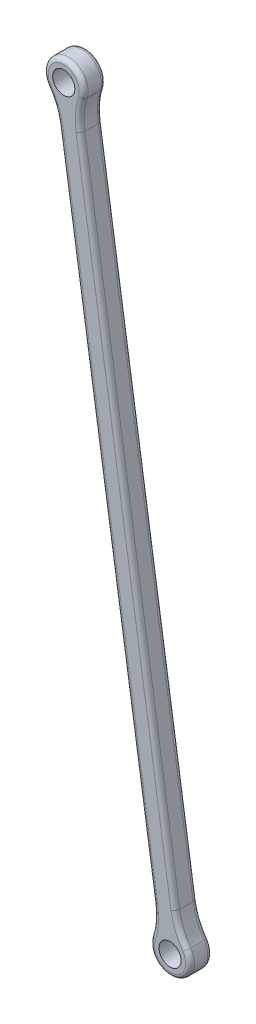
ISO-10303-21;
HEADER;
FILE_DESCRIPTION(('STEP AP214'),'2;1');
FILE_NAME('part.step','',(''),(''),'','','');
FILE_SCHEMA(('AUTOMOTIVE_DESIGN { 1 0 10303 214 1 1 1 1 }'));
ENDSEC;
DATA;
#1=APPLICATION_CONTEXT('core data for automotive mechanical design processes');
#2=APPLICATION_PROTOCOL_DEFINITION('international standard','automotive_design',2000,#1);
#3=PRODUCT_CONTEXT('',#1,'mechanical');
#4=PRODUCT('Part','Part','',(#3));
#5=PRODUCT_RELATED_PRODUCT_CATEGORY('part','',(#4));
#6=PRODUCT_DEFINITION_FORMATION('','',#4);
#7=PRODUCT_DEFINITION_CONTEXT('part definition',#1,'design');
#8=PRODUCT_DEFINITION('design','',#6,#7);
#9=PRODUCT_DEFINITION_SHAPE('','',#8);
#10=(LENGTH_UNIT() NAMED_UNIT(*) SI_UNIT(.MILLI.,.METRE.));
#11=(NAMED_UNIT(*) PLANE_ANGLE_UNIT() SI_UNIT($,.RADIAN.));
#12=(NAMED_UNIT(*) SI_UNIT($,.STERADIAN.) SOLID_ANGLE_UNIT());
#13=UNCERTAINTY_MEASURE_WITH_UNIT(LENGTH_MEASURE(1.E-05),#10,'distance_accuracy_value','');
#14=(GEOMETRIC_REPRESENTATION_CONTEXT(3) GLOBAL_UNCERTAINTY_ASSIGNED_CONTEXT((#13)) GLOBAL_UNIT_ASSIGNED_CONTEXT((#10,
#11,#12)) REPRESENTATION_CONTEXT('',''));
#15=CARTESIAN_POINT('',(0.,0.,0.));
#16=DIRECTION('',(0.,0.,1.));
#17=DIRECTION('',(1.,0.,0.));
#18=AXIS2_PLACEMENT_3D('',#15,#16,#17);
#19=CARTESIAN_POINT('',(44.6682604302253,6.76720332353716,2.5));
#20=DIRECTION('',(0.988717847963602,0.149789909934624,0.));
#21=DIRECTION('',(-0.149789909934624,0.988717847963602,0.));
#22=AXIS2_PLACEMENT_3D('',#19,#20,#21);
#23=PLANE('',#22);
#24=DIRECTION('',(0.,0.,-1.));
#25=VECTOR('',#24,1.);
#26=CARTESIAN_POINT('',(34.3540168829649,74.8484024368196,2.5));
#27=LINE('',#26,#25);
#28=CARTESIAN_POINT('',(34.3540168829649,74.8484024368196,1.5));
#29=VERTEX_POINT('',#28);
#30=CARTESIAN_POINT('',(34.3540168829649,74.8484024368196,-1.5));
#31=VERTEX_POINT('',#30);
#32=EDGE_CURVE('E298',#29,#31,#27,.T.);
#33=ORIENTED_EDGE('',*,*,#32,.T.);
#34=DIRECTION('',(0.149789909934624,-0.988717847963602,0.));
#35=VECTOR('',#34,1.);
#36=CARTESIAN_POINT('',(12.9647143473823,216.032713059969,-1.5));
#37=LINE('',#36,#35);
#38=CARTESIAN_POINT('',(12.9647143473823,216.032713059969,-1.5));
#39=VERTEX_POINT('',#38);
#40=EDGE_CURVE('E232',#31,#39,#37,.F.);
#41=ORIENTED_EDGE('',*,*,#40,.T.);
#42=DIRECTION('',(0.,0.,-1.));
#43=VECTOR('',#42,1.);
#44=CARTESIAN_POINT('',(12.9647143473823,216.032713059969,2.5));
#45=LINE('',#44,#43);
#46=CARTESIAN_POINT('',(12.9647143473823,216.032713059969,1.5));
#47=VERTEX_POINT('',#46);
#48=EDGE_CURVE('E294',#39,#47,#45,.F.);
#49=ORIENTED_EDGE('',*,*,#48,.T.);
#50=DIRECTION('',(0.149789909934624,-0.988717847963602,0.));
#51=VECTOR('',#50,1.);
#52=CARTESIAN_POINT('',(44.6682604302253,6.76720332353716,1.5));
#53=LINE('',#52,#51);
#54=EDGE_CURVE('E230',#47,#29,#53,.T.);
#55=ORIENTED_EDGE('',*,*,#54,.T.);
#56=EDGE_LOOP('',(#33,#41,#49,#55));
#57=FACE_BOUND('',#56,.T.);
#58=ADVANCED_FACE('F34',(#57),#23,.T.);
#59=CARTESIAN_POINT('',(9.20437820049462,224.163510810646,2.5));
#60=DIRECTION('',(0.,0.,-1.));
#61=DIRECTION('',(-1.,0.,0.));
#62=AXIS2_PLACEMENT_3D('',#59,#60,#61);
#63=CYLINDRICAL_SURFACE('',#62,4.50000000000002);
#64=DIRECTION('',(0.,0.,-1.));
#65=VECTOR('',#64,1.);
#66=CARTESIAN_POINT('',(13.4946329388812,222.805676402571,2.5));
#67=LINE('',#66,#65);
#68=CARTESIAN_POINT('',(13.4946329388812,222.805676402571,1.5));
#69=VERTEX_POINT('',#68);
#70=CARTESIAN_POINT('',(13.4946329388812,222.805676402571,-1.5));
#71=VERTEX_POINT('',#70);
#72=EDGE_CURVE('E173',#69,#71,#67,.T.);
#73=ORIENTED_EDGE('',*,*,#72,.T.);
#74=CARTESIAN_POINT('',(9.20437820049462,224.163510810646,-1.5));
#75=DIRECTION('',(0.,0.,1.));
#76=DIRECTION('',(1.,0.,0.));
#77=AXIS2_PLACEMENT_3D('',#74,#75,#76);
#78=CIRCLE('',#77,4.50000000000002);
#79=CARTESIAN_POINT('',(5.5088349360982,221.59583482233,-1.5));
#80=VERTEX_POINT('',#79);
#81=EDGE_CURVE('E228',#71,#80,#78,.T.);
#82=ORIENTED_EDGE('',*,*,#81,.T.);
#83=DIRECTION('',(0.,0.,-1.));
#84=VECTOR('',#83,1.);
#85=CARTESIAN_POINT('',(5.5088349360982,221.59583482233,2.5));
#86=LINE('',#85,#84);
#87=CARTESIAN_POINT('',(5.5088349360982,221.59583482233,1.5));
#88=VERTEX_POINT('',#87);
#89=EDGE_CURVE('E176',#80,#88,#86,.F.);
#90=ORIENTED_EDGE('',*,*,#89,.T.);
#91=CARTESIAN_POINT('',(9.20437820049462,224.163510810646,1.5));
#92=DIRECTION('',(0.,0.,1.));
#93=DIRECTION('',(1.,0.,0.));
#94=AXIS2_PLACEMENT_3D('',#91,#92,#93);
#95=CIRCLE('',#94,4.50000000000002);
#96=EDGE_CURVE('E226',#88,#69,#95,.F.);
#97=ORIENTED_EDGE('',*,*,#96,.T.);
#98=EDGE_LOOP('',(#73,#82,#90,#97));
#99=FACE_BOUND('',#98,.T.);
#100=ADVANCED_FACE('F308',(#99),#63,.T.);
#101=CARTESIAN_POINT('',(39.7246711904073,6.01825377386403,2.5));
#102=DIRECTION('',(0.988717847963602,0.149789909934624,0.));
#103=DIRECTION('',(-0.149789909934624,0.988717847963602,0.));
#104=AXIS2_PLACEMENT_3D('',#101,#102,#103);
#105=PLANE('',#104);
#106=DIRECTION('',(0.,0.,1.));
#107=VECTOR('',#106,1.);
#108=CARTESIAN_POINT('',(8.02112510756427,215.283763510296,-2.5));
#109=LINE('',#108,#107);
#110=CARTESIAN_POINT('',(8.02112510756427,215.283763510296,1.5));
#111=VERTEX_POINT('',#110);
#112=CARTESIAN_POINT('',(8.02112510756427,215.283763510296,-1.5));
#113=VERTEX_POINT('',#112);
#114=EDGE_CURVE('E295',#111,#113,#109,.F.);
#115=ORIENTED_EDGE('',*,*,#114,.T.);
#116=DIRECTION('',(0.149789909934624,-0.988717847963602,0.));
#117=VECTOR('',#116,1.);
#118=CARTESIAN_POINT('',(39.7246711904073,6.01825377386403,-1.5));
#119=LINE('',#118,#117);
#120=CARTESIAN_POINT('',(29.4104276431468,74.0994528871465,-1.5));
#121=VERTEX_POINT('',#120);
#122=EDGE_CURVE('E224',#113,#121,#119,.T.);
#123=ORIENTED_EDGE('',*,*,#122,.T.);
#124=DIRECTION('',(0.,0.,1.));
#125=VECTOR('',#124,1.);
#126=CARTESIAN_POINT('',(29.4104276431468,74.0994528871465,2.5));
#127=LINE('',#126,#125);
#128=CARTESIAN_POINT('',(29.4104276431468,74.0994528871465,1.5));
#129=VERTEX_POINT('',#128);
#130=EDGE_CURVE('E285',#121,#129,#127,.T.);
#131=ORIENTED_EDGE('',*,*,#130,.T.);
#132=DIRECTION('',(0.149789909934624,-0.988717847963602,0.));
#133=VECTOR('',#132,1.);
#134=CARTESIAN_POINT('',(8.02112510756426,215.283763510296,1.5));
#135=LINE('',#134,#133);
#136=EDGE_CURVE('E222',#129,#111,#135,.F.);
#137=ORIENTED_EDGE('',*,*,#136,.T.);
#138=EDGE_LOOP('',(#115,#123,#131,#137));
#139=FACE_BOUND('',#138,.T.);
#140=ADVANCED_FACE('F291',(#139),#105,.F.);
#141=CARTESIAN_POINT('',(33.1707637900345,65.9686551364697,2.5));
#142=DIRECTION('',(0.,0.,-1.));
#143=DIRECTION('',(-1.,0.,0.));
#144=AXIS2_PLACEMENT_3D('',#141,#142,#143);
#145=CYLINDRICAL_SURFACE('',#144,4.50000000000002);
#146=DIRECTION('',(0.,0.,-1.));
#147=VECTOR('',#146,1.);
#148=CARTESIAN_POINT('',(28.8805090516479,67.3264895445445,2.5));
#149=LINE('',#148,#147);
#150=CARTESIAN_POINT('',(28.8805090516479,67.3264895445445,1.5));
#151=VERTEX_POINT('',#150);
#152=CARTESIAN_POINT('',(28.8805090516479,67.3264895445445,-1.5));
#153=VERTEX_POINT('',#152);
#154=EDGE_CURVE('E288',#151,#153,#149,.T.);
#155=ORIENTED_EDGE('',*,*,#154,.T.);
#156=CARTESIAN_POINT('',(33.1707637900345,65.9686551364697,-1.5));
#157=DIRECTION('',(0.,0.,1.));
#158=DIRECTION('',(1.,0.,0.));
#159=AXIS2_PLACEMENT_3D('',#156,#157,#158);
#160=CIRCLE('',#159,4.50000000000002);
#161=CARTESIAN_POINT('',(36.8663070544309,68.5363311247857,-1.5));
#162=VERTEX_POINT('',#161);
#163=EDGE_CURVE('E11',#153,#162,#160,.T.);
#164=ORIENTED_EDGE('',*,*,#163,.T.);
#165=DIRECTION('',(0.,0.,-1.));
#166=VECTOR('',#165,1.);
#167=CARTESIAN_POINT('',(36.8663070544309,68.5363311247857,2.5));
#168=LINE('',#167,#166);
#169=CARTESIAN_POINT('',(36.8663070544309,68.5363311247857,1.5));
#170=VERTEX_POINT('',#169);
#171=EDGE_CURVE('E613',#162,#170,#168,.F.);
#172=ORIENTED_EDGE('',*,*,#171,.T.);
#173=CARTESIAN_POINT('',(33.1707637900345,65.9686551364697,1.5));
#174=DIRECTION('',(0.,0.,1.));
#175=DIRECTION('',(1.,0.,0.));
#176=AXIS2_PLACEMENT_3D('',#173,#174,#175);
#177=CIRCLE('',#176,4.50000000000002);
#178=EDGE_CURVE('E43',#170,#151,#177,.F.);
#179=ORIENTED_EDGE('',*,*,#178,.T.);
#180=EDGE_LOOP('',(#155,#164,#172,#179));
#181=FACE_BOUND('',#180,.T.);
#182=ADVANCED_FACE('F373',(#181),#145,.T.);
#183=CARTESIAN_POINT('',(33.1707637900345,65.9686551364697,2.5));
#184=DIRECTION('',(0.,0.,-1.));
#185=DIRECTION('',(-1.,0.,0.));
#186=AXIS2_PLACEMENT_3D('',#183,#184,#185);
#187=CYLINDRICAL_SURFACE('',#186,2.5);
#188=CARTESIAN_POINT('',(33.1707637900345,65.9686551364697,2.5));
#189=DIRECTION('',(0.,0.,1.));
#190=DIRECTION('',(1.,0.,0.));
#191=AXIS2_PLACEMENT_3D('',#188,#189,#190);
#192=CIRCLE('',#191,2.5);
#193=CARTESIAN_POINT('',(35.6707637900345,65.9686551364697,2.5));
#194=VERTEX_POINT('',#193);
#195=EDGE_CURVE('E605',#194,#194,#192,.T.);
#196=ORIENTED_EDGE('',*,*,#195,.T.);
#197=EDGE_LOOP('',(#196));
#198=FACE_BOUND('',#197,.T.);
#199=CARTESIAN_POINT('',(33.1707637900345,65.9686551364697,-2.5));
#200=DIRECTION('',(0.,0.,1.));
#201=DIRECTION('',(1.,0.,0.));
#202=AXIS2_PLACEMENT_3D('',#199,#200,#201);
#203=CIRCLE('',#202,2.5);
#204=CARTESIAN_POINT('',(35.6707637900345,65.9686551364697,-2.5));
#205=VERTEX_POINT('',#204);
#206=EDGE_CURVE('E250',#205,#205,#203,.T.);
#207=ORIENTED_EDGE('',*,*,#206,.F.);
#208=EDGE_LOOP('',(#207));
#209=FACE_BOUND('',#208,.T.);
#210=ADVANCED_FACE('F369',(#198,#209),#187,.F.);
#211=CARTESIAN_POINT('',(9.20437820049462,224.163510810646,2.5));
#212=DIRECTION('',(0.,0.,-1.));
#213=DIRECTION('',(-1.,0.,0.));
#214=AXIS2_PLACEMENT_3D('',#211,#212,#213);
#215=CYLINDRICAL_SURFACE('',#214,2.5);
#216=CARTESIAN_POINT('',(9.20437820049462,224.163510810646,2.5));
#217=DIRECTION('',(0.,0.,1.));
#218=DIRECTION('',(1.,0.,0.));
#219=AXIS2_PLACEMENT_3D('',#216,#217,#218);
#220=CIRCLE('',#219,2.5);
#221=CARTESIAN_POINT('',(11.7043782004946,224.163510810646,2.5));
#222=VERTEX_POINT('',#221);
#223=EDGE_CURVE('E600',#222,#222,#220,.T.);
#224=ORIENTED_EDGE('',*,*,#223,.T.);
#225=EDGE_LOOP('',(#224));
#226=FACE_BOUND('',#225,.T.);
#227=CARTESIAN_POINT('',(9.20437820049462,224.163510810646,-2.5));
#228=DIRECTION('',(0.,0.,1.));
#229=DIRECTION('',(1.,0.,0.));
#230=AXIS2_PLACEMENT_3D('',#227,#228,#229);
#231=CIRCLE('',#230,2.5);
#232=CARTESIAN_POINT('',(11.7043782004946,224.163510810646,-2.5));
#233=VERTEX_POINT('',#232);
#234=EDGE_CURVE('E603',#233,#233,#231,.T.);
#235=ORIENTED_EDGE('',*,*,#234,.F.);
#236=EDGE_LOOP('',(#235));
#237=FACE_BOUND('',#236,.T.);
#238=ADVANCED_FACE('F372',(#226,#237),#215,.F.);
#239=CARTESIAN_POINT('',(0.,0.,2.5));
#240=DIRECTION('',(0.,0.,1.));
#241=DIRECTION('',(1.,0.,0.));
#242=AXIS2_PLACEMENT_3D('',#239,#240,#241);
#243=PLANE('',#242);
#244=CARTESIAN_POINT('',(-6.80964261188977,213.036914861277,2.5));
#245=DIRECTION('',(0.,0.,1.));
#246=DIRECTION('',(1.,0.,0.));
#247=AXIS2_PLACEMENT_3D('',#244,#245,#246);
#248=CIRCLE('',#247,16.);
#249=CARTESIAN_POINT('',(6.33006677263073,222.1664294864,2.5));
#250=VERTEX_POINT('',#249);
#251=CARTESIAN_POINT('',(9.00984295552787,215.433553420231,2.5));
#252=VERTEX_POINT('',#251);
#253=EDGE_CURVE('E51',#250,#252,#248,.F.);
#254=ORIENTED_EDGE('',*,*,#253,.T.);
#255=DIRECTION('',(0.149789909934624,-0.988717847963602,0.));
#256=VECTOR('',#255,1.);
#257=CARTESIAN_POINT('',(30.3991454911104,74.2492427970811,2.5));
#258=LINE('',#257,#256);
#259=CARTESIAN_POINT('',(30.3991454911104,74.2492427970811,2.5));
#260=VERTEX_POINT('',#259);
#261=EDGE_CURVE('E55',#252,#260,#258,.T.);
#262=ORIENTED_EDGE('',*,*,#261,.T.);
#263=CARTESIAN_POINT('',(14.5796599236928,71.8526042381271,2.5));
#264=DIRECTION('',(0.,0.,1.));
#265=DIRECTION('',(1.,0.,0.));
#266=AXIS2_PLACEMENT_3D('',#263,#264,#265);
#267=CIRCLE('',#266,16.);
#268=CARTESIAN_POINT('',(29.8338989935116,67.0247485649723,2.5));
#269=VERTEX_POINT('',#268);
#270=EDGE_CURVE('E218',#260,#269,#267,.F.);
#271=ORIENTED_EDGE('',*,*,#270,.T.);
#272=CARTESIAN_POINT('',(33.1707637900345,65.9686551364697,2.5));
#273=DIRECTION('',(0.,0.,1.));
#274=DIRECTION('',(1.,0.,0.));
#275=AXIS2_PLACEMENT_3D('',#272,#273,#274);
#276=CIRCLE('',#275,3.50000000000002);
#277=CARTESIAN_POINT('',(36.0450752178984,67.9657364607155,2.5));
#278=VERTEX_POINT('',#277);
#279=EDGE_CURVE('E216',#269,#278,#276,.T.);
#280=ORIENTED_EDGE('',*,*,#279,.T.);
#281=CARTESIAN_POINT('',(49.1847846024189,77.095251085839,2.5));
#282=DIRECTION('',(0.,0.,1.));
#283=DIRECTION('',(1.,0.,0.));
#284=AXIS2_PLACEMENT_3D('',#281,#282,#283);
#285=CIRCLE('',#284,16.);
#286=CARTESIAN_POINT('',(33.3652990350013,74.698612526885,2.5));
#287=VERTEX_POINT('',#286);
#288=EDGE_CURVE('E209',#278,#287,#285,.F.);
#289=ORIENTED_EDGE('',*,*,#288,.T.);
#290=DIRECTION('',(0.149789909934624,-0.988717847963602,0.));
#291=VECTOR('',#290,1.);
#292=CARTESIAN_POINT('',(43.6795425822617,6.61741341360253,2.5));
#293=LINE('',#292,#291);
#294=CARTESIAN_POINT('',(11.9759964994187,215.882923150035,2.5));
#295=VERTEX_POINT('',#294);
#296=EDGE_CURVE('E207',#287,#295,#293,.F.);
#297=ORIENTED_EDGE('',*,*,#296,.T.);
#298=CARTESIAN_POINT('',(27.7954820668363,218.279561708989,2.5));
#299=DIRECTION('',(0.,0.,1.));
#300=DIRECTION('',(1.,0.,0.));
#301=AXIS2_PLACEMENT_3D('',#298,#299,#300);
#302=CIRCLE('',#301,16.);
#303=CARTESIAN_POINT('',(12.5412429970175,223.107417382143,2.5));
#304=VERTEX_POINT('',#303);
#305=EDGE_CURVE('E211',#295,#304,#302,.F.);
#306=ORIENTED_EDGE('',*,*,#305,.T.);
#307=CARTESIAN_POINT('',(9.20437820049462,224.163510810646,2.5));
#308=DIRECTION('',(0.,0.,1.));
#309=DIRECTION('',(1.,0.,0.));
#310=AXIS2_PLACEMENT_3D('',#307,#308,#309);
#311=CIRCLE('',#310,3.50000000000002);
#312=EDGE_CURVE('E214',#304,#250,#311,.T.);
#313=ORIENTED_EDGE('',*,*,#312,.T.);
#314=EDGE_LOOP('',(#254,#262,#271,#280,#289,#297,#306,#313));
#315=FACE_BOUND('',#314,.T.);
#316=ORIENTED_EDGE('',*,*,#195,.F.);
#317=EDGE_LOOP('',(#316));
#318=FACE_BOUND('',#317,.T.);
#319=ORIENTED_EDGE('',*,*,#223,.F.);
#320=EDGE_LOOP('',(#319));
#321=FACE_BOUND('',#320,.T.);
#322=ADVANCED_FACE('F525',(#315,#318,#321),#243,.T.);
#323=CARTESIAN_POINT('',(0.,0.,-2.5));
#324=DIRECTION('',(0.,0.,1.));
#325=DIRECTION('',(1.,0.,0.));
#326=AXIS2_PLACEMENT_3D('',#323,#324,#325);
#327=PLANE('',#326);
#328=CARTESIAN_POINT('',(-6.80964261188977,213.036914861277,-2.5));
#329=DIRECTION('',(0.,0.,1.));
#330=DIRECTION('',(1.,0.,0.));
#331=AXIS2_PLACEMENT_3D('',#328,#329,#330);
#332=CIRCLE('',#331,16.);
#333=CARTESIAN_POINT('',(9.00984295552787,215.433553420231,-2.5));
#334=VERTEX_POINT('',#333);
#335=CARTESIAN_POINT('',(6.33006677263074,222.1664294864,-2.5));
#336=VERTEX_POINT('',#335);
#337=EDGE_CURVE('E186',#334,#336,#332,.T.);
#338=ORIENTED_EDGE('',*,*,#337,.T.);
#339=CARTESIAN_POINT('',(9.20437820049462,224.163510810646,-2.5));
#340=DIRECTION('',(0.,0.,1.));
#341=DIRECTION('',(1.,0.,0.));
#342=AXIS2_PLACEMENT_3D('',#339,#340,#341);
#343=CIRCLE('',#342,3.50000000000002);
#344=CARTESIAN_POINT('',(12.5412429970175,223.107417382143,-2.5));
#345=VERTEX_POINT('',#344);
#346=EDGE_CURVE('E188',#336,#345,#343,.F.);
#347=ORIENTED_EDGE('',*,*,#346,.T.);
#348=CARTESIAN_POINT('',(27.7954820668363,218.279561708989,-2.5));
#349=DIRECTION('',(0.,0.,1.));
#350=DIRECTION('',(1.,0.,0.));
#351=AXIS2_PLACEMENT_3D('',#348,#349,#350);
#352=CIRCLE('',#351,16.);
#353=CARTESIAN_POINT('',(11.9759964994187,215.882923150035,-2.5));
#354=VERTEX_POINT('',#353);
#355=EDGE_CURVE('E184',#345,#354,#352,.T.);
#356=ORIENTED_EDGE('',*,*,#355,.T.);
#357=DIRECTION('',(0.149789909934624,-0.988717847963602,0.));
#358=VECTOR('',#357,1.);
#359=CARTESIAN_POINT('',(33.3652990350013,74.698612526885,-2.5));
#360=LINE('',#359,#358);
#361=CARTESIAN_POINT('',(33.3652990350013,74.698612526885,-2.5));
#362=VERTEX_POINT('',#361);
#363=EDGE_CURVE('E154',#354,#362,#360,.T.);
#364=ORIENTED_EDGE('',*,*,#363,.T.);
#365=CARTESIAN_POINT('',(49.1847846024189,77.095251085839,-2.5));
#366=DIRECTION('',(0.,0.,1.));
#367=DIRECTION('',(1.,0.,0.));
#368=AXIS2_PLACEMENT_3D('',#365,#366,#367);
#369=CIRCLE('',#368,16.);
#370=CARTESIAN_POINT('',(36.0450752178984,67.9657364607155,-2.5));
#371=VERTEX_POINT('',#370);
#372=EDGE_CURVE('E145',#362,#371,#369,.T.);
#373=ORIENTED_EDGE('',*,*,#372,.T.);
#374=CARTESIAN_POINT('',(33.1707637900345,65.9686551364697,-2.5));
#375=DIRECTION('',(0.,0.,1.));
#376=DIRECTION('',(1.,0.,0.));
#377=AXIS2_PLACEMENT_3D('',#374,#375,#376);
#378=CIRCLE('',#377,3.50000000000002);
#379=CARTESIAN_POINT('',(29.8338989935116,67.0247485649723,-2.5));
#380=VERTEX_POINT('',#379);
#381=EDGE_CURVE('E151',#371,#380,#378,.F.);
#382=ORIENTED_EDGE('',*,*,#381,.T.);
#383=CARTESIAN_POINT('',(14.5796599236928,71.8526042381271,-2.5));
#384=DIRECTION('',(0.,0.,1.));
#385=DIRECTION('',(1.,0.,0.));
#386=AXIS2_PLACEMENT_3D('',#383,#384,#385);
#387=CIRCLE('',#386,16.);
#388=CARTESIAN_POINT('',(30.3991454911104,74.2492427970811,-2.5));
#389=VERTEX_POINT('',#388);
#390=EDGE_CURVE('E158',#380,#389,#387,.T.);
#391=ORIENTED_EDGE('',*,*,#390,.T.);
#392=DIRECTION('',(0.149789909934624,-0.988717847963602,0.));
#393=VECTOR('',#392,1.);
#394=CARTESIAN_POINT('',(40.7133890383709,6.16804368379866,-2.5));
#395=LINE('',#394,#393);
#396=EDGE_CURVE('E182',#389,#334,#395,.F.);
#397=ORIENTED_EDGE('',*,*,#396,.T.);
#398=EDGE_LOOP('',(#338,#347,#356,#364,#373,#382,#391,#397));
#399=FACE_BOUND('',#398,.T.);
#400=ORIENTED_EDGE('',*,*,#206,.T.);
#401=EDGE_LOOP('',(#400));
#402=FACE_BOUND('',#401,.T.);
#403=ORIENTED_EDGE('',*,*,#234,.T.);
#404=EDGE_LOOP('',(#403));
#405=FACE_BOUND('',#404,.T.);
#406=ADVANCED_FACE('F147',(#399,#402,#405),#327,.F.);
#407=CARTESIAN_POINT('',(14.5796599236928,71.8526042381271,2.5));
#408=DIRECTION('',(0.,0.,-1.));
#409=DIRECTION('',(-1.,0.,0.));
#410=AXIS2_PLACEMENT_3D('',#407,#408,#409);
#411=CYLINDRICAL_SURFACE('',#410,15.);
#412=ORIENTED_EDGE('',*,*,#130,.F.);
#413=CARTESIAN_POINT('',(14.5796599236928,71.8526042381271,-1.5));
#414=DIRECTION('',(0.,0.,1.));
#415=DIRECTION('',(1.,0.,0.));
#416=AXIS2_PLACEMENT_3D('',#413,#414,#415);
#417=CIRCLE('',#416,15.);
#418=EDGE_CURVE('E192',#121,#153,#417,.F.);
#419=ORIENTED_EDGE('',*,*,#418,.T.);
#420=ORIENTED_EDGE('',*,*,#154,.F.);
#421=CARTESIAN_POINT('',(14.5796599236928,71.8526042381271,1.5));
#422=DIRECTION('',(0.,0.,1.));
#423=DIRECTION('',(1.,0.,0.));
#424=AXIS2_PLACEMENT_3D('',#421,#422,#423);
#425=CIRCLE('',#424,15.);
#426=EDGE_CURVE('E190',#151,#129,#425,.T.);
#427=ORIENTED_EDGE('',*,*,#426,.T.);
#428=EDGE_LOOP('',(#412,#419,#420,#427));
#429=FACE_BOUND('',#428,.T.);
#430=ADVANCED_FACE('F284',(#429),#411,.F.);
#431=CARTESIAN_POINT('',(49.1847846024189,77.095251085839,2.5));
#432=DIRECTION('',(0.,0.,-1.));
#433=DIRECTION('',(-1.,0.,0.));
#434=AXIS2_PLACEMENT_3D('',#431,#432,#433);
#435=CYLINDRICAL_SURFACE('',#434,15.);
#436=ORIENTED_EDGE('',*,*,#171,.F.);
#437=CARTESIAN_POINT('',(49.1847846024189,77.095251085839,-1.5));
#438=DIRECTION('',(0.,0.,1.));
#439=DIRECTION('',(1.,0.,0.));
#440=AXIS2_PLACEMENT_3D('',#437,#438,#439);
#441=CIRCLE('',#440,15.);
#442=EDGE_CURVE('E164',#162,#31,#441,.F.);
#443=ORIENTED_EDGE('',*,*,#442,.T.);
#444=ORIENTED_EDGE('',*,*,#32,.F.);
#445=CARTESIAN_POINT('',(49.1847846024189,77.095251085839,1.5));
#446=DIRECTION('',(0.,0.,1.));
#447=DIRECTION('',(1.,0.,0.));
#448=AXIS2_PLACEMENT_3D('',#445,#446,#447);
#449=CIRCLE('',#448,15.);
#450=EDGE_CURVE('E204',#29,#170,#449,.T.);
#451=ORIENTED_EDGE('',*,*,#450,.T.);
#452=EDGE_LOOP('',(#436,#443,#444,#451));
#453=FACE_BOUND('',#452,.T.);
#454=ADVANCED_FACE('F377',(#453),#435,.F.);
#455=CARTESIAN_POINT('',(27.7954820668363,218.279561708989,2.5));
#456=DIRECTION('',(0.,0.,-1.));
#457=DIRECTION('',(-1.,0.,0.));
#458=AXIS2_PLACEMENT_3D('',#455,#456,#457);
#459=CYLINDRICAL_SURFACE('',#458,15.);
#460=ORIENTED_EDGE('',*,*,#48,.F.);
#461=CARTESIAN_POINT('',(27.7954820668363,218.279561708989,-1.5));
#462=DIRECTION('',(0.,0.,1.));
#463=DIRECTION('',(1.,0.,0.));
#464=AXIS2_PLACEMENT_3D('',#461,#462,#463);
#465=CIRCLE('',#464,15.);
#466=EDGE_CURVE('E202',#39,#71,#465,.F.);
#467=ORIENTED_EDGE('',*,*,#466,.T.);
#468=ORIENTED_EDGE('',*,*,#72,.F.);
#469=CARTESIAN_POINT('',(27.7954820668363,218.279561708989,1.5));
#470=DIRECTION('',(0.,0.,1.));
#471=DIRECTION('',(1.,0.,0.));
#472=AXIS2_PLACEMENT_3D('',#469,#470,#471);
#473=CIRCLE('',#472,15.);
#474=EDGE_CURVE('E199',#69,#47,#473,.T.);
#475=ORIENTED_EDGE('',*,*,#474,.T.);
#476=EDGE_LOOP('',(#460,#467,#468,#475));
#477=FACE_BOUND('',#476,.T.);
#478=ADVANCED_FACE('F329',(#477),#459,.F.);
#479=CARTESIAN_POINT('',(-6.80964261188977,213.036914861277,2.5));
#480=DIRECTION('',(0.,0.,-1.));
#481=DIRECTION('',(-1.,0.,0.));
#482=AXIS2_PLACEMENT_3D('',#479,#480,#481);
#483=CYLINDRICAL_SURFACE('',#482,15.);
#484=ORIENTED_EDGE('',*,*,#89,.F.);
#485=CARTESIAN_POINT('',(-6.80964261188977,213.036914861277,-1.5));
#486=DIRECTION('',(0.,0.,1.));
#487=DIRECTION('',(1.,0.,0.));
#488=AXIS2_PLACEMENT_3D('',#485,#486,#487);
#489=CIRCLE('',#488,15.);
#490=EDGE_CURVE('E197',#80,#113,#489,.F.);
#491=ORIENTED_EDGE('',*,*,#490,.T.);
#492=ORIENTED_EDGE('',*,*,#114,.F.);
#493=CARTESIAN_POINT('',(-6.80964261188977,213.036914861277,1.5));
#494=DIRECTION('',(0.,0.,1.));
#495=DIRECTION('',(1.,0.,0.));
#496=AXIS2_PLACEMENT_3D('',#493,#494,#495);
#497=CIRCLE('',#496,15.);
#498=EDGE_CURVE('E195',#111,#88,#497,.T.);
#499=ORIENTED_EDGE('',*,*,#498,.T.);
#500=EDGE_LOOP('',(#484,#491,#492,#499));
#501=FACE_BOUND('',#500,.T.);
#502=ADVANCED_FACE('F349',(#501),#483,.F.);
#503=CARTESIAN_POINT('',(27.7954820668363,218.279561708989,-1.5));
#504=DIRECTION('',(0.,0.,1.));
#505=DIRECTION('',(1.,0.,0.));
#506=AXIS2_PLACEMENT_3D('',#503,#504,#505);
#507=TOROIDAL_SURFACE('',#506,16.,1.);
#508=CARTESIAN_POINT('',(12.5412429970175,223.107417382143,-1.5));
#509=DIRECTION('',(0.301740979572169,0.953389941863678,0.));
#510=DIRECTION('',(-0.953389941863678,0.301740979572169,0.));
#511=AXIS2_PLACEMENT_3D('',#508,#509,#510);
#512=CIRCLE('',#511,1.);
#513=EDGE_CURVE('E244',#71,#345,#512,.T.);
#514=ORIENTED_EDGE('',*,*,#513,.F.);
#515=ORIENTED_EDGE('',*,*,#466,.F.);
#516=CARTESIAN_POINT('',(11.9759964994187,215.882923150035,-1.5));
#517=DIRECTION('',(0.149789909934639,-0.9887178479636,0.));
#518=DIRECTION('',(0.9887178479636,0.149789909934639,0.));
#519=AXIS2_PLACEMENT_3D('',#516,#517,#518);
#520=CIRCLE('',#519,1.);
#521=EDGE_CURVE('E247',#354,#39,#520,.T.);
#522=ORIENTED_EDGE('',*,*,#521,.F.);
#523=ORIENTED_EDGE('',*,*,#355,.F.);
#524=EDGE_LOOP('',(#514,#515,#522,#523));
#525=FACE_BOUND('',#524,.T.);
#526=ADVANCED_FACE('F340',(#525),#507,.T.);
#527=CARTESIAN_POINT('',(43.6795425822617,6.61741341360253,-1.5));
#528=DIRECTION('',(-0.149789909934624,0.988717847963602,0.));
#529=DIRECTION('',(-0.988717847963602,-0.149789909934624,0.));
#530=AXIS2_PLACEMENT_3D('',#527,#528,#529);
#531=CYLINDRICAL_SURFACE('',#530,1.);
#532=ORIENTED_EDGE('',*,*,#521,.T.);
#533=ORIENTED_EDGE('',*,*,#40,.F.);
#534=CARTESIAN_POINT('',(33.3652990350013,74.698612526885,-1.5));
#535=DIRECTION('',(0.149789909934625,-0.988717847963602,0.));
#536=DIRECTION('',(0.988717847963602,0.149789909934625,0.));
#537=AXIS2_PLACEMENT_3D('',#534,#535,#536);
#538=CIRCLE('',#537,1.);
#539=EDGE_CURVE('E242',#362,#31,#538,.T.);
#540=ORIENTED_EDGE('',*,*,#539,.F.);
#541=ORIENTED_EDGE('',*,*,#363,.F.);
#542=EDGE_LOOP('',(#532,#533,#540,#541));
#543=FACE_BOUND('',#542,.T.);
#544=ADVANCED_FACE('F335',(#543),#531,.T.);
#545=CARTESIAN_POINT('',(9.20437820049462,224.163510810646,-1.5));
#546=DIRECTION('',(0.,0.,1.));
#547=DIRECTION('',(1.,0.,0.));
#548=AXIS2_PLACEMENT_3D('',#545,#546,#547);
#549=TOROIDAL_SURFACE('',#548,3.50000000000002,1.);
#550=ORIENTED_EDGE('',*,*,#513,.T.);
#551=ORIENTED_EDGE('',*,*,#346,.F.);
#552=CARTESIAN_POINT('',(6.33006677263074,222.1664294864,-1.5));
#553=DIRECTION('',(0.57059466407022,-0.82123183653253,0.));
#554=DIRECTION('',(0.82123183653253,0.570594664070221,0.));
#555=AXIS2_PLACEMENT_3D('',#552,#553,#554);
#556=CIRCLE('',#555,1.);
#557=EDGE_CURVE('E167',#80,#336,#556,.T.);
#558=ORIENTED_EDGE('',*,*,#557,.F.);
#559=ORIENTED_EDGE('',*,*,#81,.F.);
#560=EDGE_LOOP('',(#550,#551,#558,#559));
#561=FACE_BOUND('',#560,.T.);
#562=ADVANCED_FACE('F343',(#561),#549,.T.);
#563=CARTESIAN_POINT('',(49.1847846024189,77.095251085839,-1.5));
#564=DIRECTION('',(0.,0.,1.));
#565=DIRECTION('',(1.,0.,0.));
#566=AXIS2_PLACEMENT_3D('',#563,#564,#565);
#567=TOROIDAL_SURFACE('',#566,16.,1.);
#568=ORIENTED_EDGE('',*,*,#539,.T.);
#569=ORIENTED_EDGE('',*,*,#442,.F.);
#570=CARTESIAN_POINT('',(36.0450752178984,67.9657364607155,-1.5));
#571=DIRECTION('',(0.570594664070223,-0.821231836532529,0.));
#572=DIRECTION('',(0.821231836532529,0.570594664070223,0.));
#573=AXIS2_PLACEMENT_3D('',#570,#571,#572);
#574=CIRCLE('',#573,1.);
#575=EDGE_CURVE('E162',#371,#162,#574,.T.);
#576=ORIENTED_EDGE('',*,*,#575,.F.);
#577=ORIENTED_EDGE('',*,*,#372,.F.);
#578=EDGE_LOOP('',(#568,#569,#576,#577));
#579=FACE_BOUND('',#578,.T.);
#580=ADVANCED_FACE('F163',(#579),#567,.T.);
#581=CARTESIAN_POINT('',(-6.80964261188977,213.036914861277,-1.5));
#582=DIRECTION('',(0.,0.,1.));
#583=DIRECTION('',(1.,0.,0.));
#584=AXIS2_PLACEMENT_3D('',#581,#582,#583);
#585=TOROIDAL_SURFACE('',#584,16.,1.);
#586=ORIENTED_EDGE('',*,*,#557,.T.);
#587=ORIENTED_EDGE('',*,*,#337,.F.);
#588=CARTESIAN_POINT('',(9.00984295552787,215.433553420231,-1.5));
#589=DIRECTION('',(0.149789909934611,-0.988717847963604,0.));
#590=DIRECTION('',(0.988717847963604,0.149789909934611,0.));
#591=AXIS2_PLACEMENT_3D('',#588,#589,#590);
#592=CIRCLE('',#591,1.);
#593=EDGE_CURVE('E168',#113,#334,#592,.T.);
#594=ORIENTED_EDGE('',*,*,#593,.F.);
#595=ORIENTED_EDGE('',*,*,#490,.F.);
#596=EDGE_LOOP('',(#586,#587,#594,#595));
#597=FACE_BOUND('',#596,.T.);
#598=ADVANCED_FACE('F348',(#597),#585,.T.);
#599=CARTESIAN_POINT('',(33.1707637900345,65.9686551364697,-1.5));
#600=DIRECTION('',(0.,0.,1.));
#601=DIRECTION('',(1.,0.,0.));
#602=AXIS2_PLACEMENT_3D('',#599,#600,#601);
#603=TOROIDAL_SURFACE('',#602,3.50000000000002,1.);
#604=ORIENTED_EDGE('',*,*,#575,.T.);
#605=ORIENTED_EDGE('',*,*,#163,.F.);
#606=CARTESIAN_POINT('',(29.8338989935116,67.0247485649723,-1.5));
#607=DIRECTION('',(0.301740979572168,0.953389941863679,0.));
#608=DIRECTION('',(-0.953389941863679,0.301740979572168,0.));
#609=AXIS2_PLACEMENT_3D('',#606,#607,#608);
#610=CIRCLE('',#609,1.);
#611=EDGE_CURVE('E171',#380,#153,#610,.T.);
#612=ORIENTED_EDGE('',*,*,#611,.F.);
#613=ORIENTED_EDGE('',*,*,#381,.F.);
#614=EDGE_LOOP('',(#604,#605,#612,#613));
#615=FACE_BOUND('',#614,.T.);
#616=ADVANCED_FACE('F170',(#615),#603,.T.);
#617=CARTESIAN_POINT('',(40.7133890383709,6.16804368379866,-1.5));
#618=DIRECTION('',(0.149789909934624,-0.988717847963602,0.));
#619=DIRECTION('',(0.988717847963602,0.149789909934624,0.));
#620=AXIS2_PLACEMENT_3D('',#617,#618,#619);
#621=CYLINDRICAL_SURFACE('',#620,1.);
#622=ORIENTED_EDGE('',*,*,#593,.T.);
#623=ORIENTED_EDGE('',*,*,#396,.F.);
#624=CARTESIAN_POINT('',(30.3991454911104,74.2492427970811,-1.5));
#625=DIRECTION('',(0.149789909934625,-0.988717847963602,0.));
#626=DIRECTION('',(0.988717847963602,0.149789909934625,0.));
#627=AXIS2_PLACEMENT_3D('',#624,#625,#626);
#628=CIRCLE('',#627,1.);
#629=EDGE_CURVE('E235',#121,#389,#628,.T.);
#630=ORIENTED_EDGE('',*,*,#629,.F.);
#631=ORIENTED_EDGE('',*,*,#122,.F.);
#632=EDGE_LOOP('',(#622,#623,#630,#631));
#633=FACE_BOUND('',#632,.T.);
#634=ADVANCED_FACE('F388',(#633),#621,.T.);
#635=CARTESIAN_POINT('',(14.5796599236928,71.8526042381271,-1.5));
#636=DIRECTION('',(0.,0.,1.));
#637=DIRECTION('',(1.,0.,0.));
#638=AXIS2_PLACEMENT_3D('',#635,#636,#637);
#639=TOROIDAL_SURFACE('',#638,16.,1.);
#640=ORIENTED_EDGE('',*,*,#611,.T.);
#641=ORIENTED_EDGE('',*,*,#418,.F.);
#642=ORIENTED_EDGE('',*,*,#629,.T.);
#643=ORIENTED_EDGE('',*,*,#390,.F.);
#644=EDGE_LOOP('',(#640,#641,#642,#643));
#645=FACE_BOUND('',#644,.T.);
#646=ADVANCED_FACE('F385',(#645),#639,.T.);
#647=CARTESIAN_POINT('',(14.5796599236928,71.8526042381271,1.5));
#648=DIRECTION('',(0.,0.,1.));
#649=DIRECTION('',(1.,0.,0.));
#650=AXIS2_PLACEMENT_3D('',#647,#648,#649);
#651=TOROIDAL_SURFACE('',#650,16.,1.);
#652=CARTESIAN_POINT('',(30.3991454911104,74.2492427970811,1.5));
#653=DIRECTION('',(-0.149789909934625,0.988717847963602,0.));
#654=DIRECTION('',(-0.988717847963602,-0.149789909934625,0.));
#655=AXIS2_PLACEMENT_3D('',#652,#653,#654);
#656=CIRCLE('',#655,1.);
#657=EDGE_CURVE('E266',#129,#260,#656,.T.);
#658=ORIENTED_EDGE('',*,*,#657,.F.);
#659=ORIENTED_EDGE('',*,*,#426,.F.);
#660=CARTESIAN_POINT('',(29.8338989935116,67.0247485649723,1.5));
#661=DIRECTION('',(-0.301740979572168,-0.953389941863679,0.));
#662=DIRECTION('',(0.953389941863679,-0.301740979572168,0.));
#663=AXIS2_PLACEMENT_3D('',#660,#661,#662);
#664=CIRCLE('',#663,1.);
#665=EDGE_CURVE('E38',#269,#151,#664,.T.);
#666=ORIENTED_EDGE('',*,*,#665,.F.);
#667=ORIENTED_EDGE('',*,*,#270,.F.);
#668=EDGE_LOOP('',(#658,#659,#666,#667));
#669=FACE_BOUND('',#668,.T.);
#670=ADVANCED_FACE('F36',(#669),#651,.T.);
#671=CARTESIAN_POINT('',(33.1707637900345,65.9686551364697,1.5));
#672=DIRECTION('',(0.,0.,1.));
#673=DIRECTION('',(1.,0.,0.));
#674=AXIS2_PLACEMENT_3D('',#671,#672,#673);
#675=TOROIDAL_SURFACE('',#674,3.50000000000002,1.);
#676=ORIENTED_EDGE('',*,*,#665,.T.);
#677=ORIENTED_EDGE('',*,*,#178,.F.);
#678=CARTESIAN_POINT('',(36.0450752178984,67.9657364607155,1.5));
#679=DIRECTION('',(-0.570594664070223,0.821231836532529,0.));
#680=DIRECTION('',(-0.821231836532529,-0.570594664070223,0.));
#681=AXIS2_PLACEMENT_3D('',#678,#679,#680);
#682=CIRCLE('',#681,1.);
#683=EDGE_CURVE('E264',#278,#170,#682,.T.);
#684=ORIENTED_EDGE('',*,*,#683,.F.);
#685=ORIENTED_EDGE('',*,*,#279,.F.);
#686=EDGE_LOOP('',(#676,#677,#684,#685));
#687=FACE_BOUND('',#686,.T.);
#688=ADVANCED_FACE('F276',(#687),#675,.T.);
#689=CARTESIAN_POINT('',(40.7133890383709,6.16804368379866,1.5));
#690=DIRECTION('',(-0.149789909934624,0.988717847963602,0.));
#691=DIRECTION('',(-0.988717847963602,-0.149789909934624,0.));
#692=AXIS2_PLACEMENT_3D('',#689,#690,#691);
#693=CYLINDRICAL_SURFACE('',#692,1.);
#694=ORIENTED_EDGE('',*,*,#657,.T.);
#695=ORIENTED_EDGE('',*,*,#261,.F.);
#696=CARTESIAN_POINT('',(9.00984295552787,215.433553420231,1.5));
#697=DIRECTION('',(-0.149789909934611,0.988717847963604,0.));
#698=DIRECTION('',(-0.988717847963604,-0.149789909934611,0.));
#699=AXIS2_PLACEMENT_3D('',#696,#697,#698);
#700=CIRCLE('',#699,1.);
#701=EDGE_CURVE('E261',#111,#252,#700,.T.);
#702=ORIENTED_EDGE('',*,*,#701,.F.);
#703=ORIENTED_EDGE('',*,*,#136,.F.);
#704=EDGE_LOOP('',(#694,#695,#702,#703));
#705=FACE_BOUND('',#704,.T.);
#706=ADVANCED_FACE('F351',(#705),#693,.T.);
#707=CARTESIAN_POINT('',(49.1847846024189,77.095251085839,1.5));
#708=DIRECTION('',(0.,0.,1.));
#709=DIRECTION('',(1.,0.,0.));
#710=AXIS2_PLACEMENT_3D('',#707,#708,#709);
#711=TOROIDAL_SURFACE('',#710,16.,1.);
#712=ORIENTED_EDGE('',*,*,#683,.T.);
#713=ORIENTED_EDGE('',*,*,#450,.F.);
#714=CARTESIAN_POINT('',(33.3652990350013,74.698612526885,1.5));
#715=DIRECTION('',(-0.149789909934625,0.988717847963602,0.));
#716=DIRECTION('',(-0.988717847963602,-0.149789909934625,0.));
#717=AXIS2_PLACEMENT_3D('',#714,#715,#716);
#718=CIRCLE('',#717,1.);
#719=EDGE_CURVE('E258',#287,#29,#718,.T.);
#720=ORIENTED_EDGE('',*,*,#719,.F.);
#721=ORIENTED_EDGE('',*,*,#288,.F.);
#722=EDGE_LOOP('',(#712,#713,#720,#721));
#723=FACE_BOUND('',#722,.T.);
#724=ADVANCED_FACE('F353',(#723),#711,.T.);
#725=CARTESIAN_POINT('',(-6.80964261188977,213.036914861277,1.5));
#726=DIRECTION('',(0.,0.,1.));
#727=DIRECTION('',(1.,0.,0.));
#728=AXIS2_PLACEMENT_3D('',#725,#726,#727);
#729=TOROIDAL_SURFACE('',#728,16.,1.);
#730=ORIENTED_EDGE('',*,*,#701,.T.);
#731=ORIENTED_EDGE('',*,*,#253,.F.);
#732=CARTESIAN_POINT('',(6.33006677263074,222.1664294864,1.5));
#733=DIRECTION('',(-0.570594664070221,0.82123183653253,0.));
#734=DIRECTION('',(-0.82123183653253,-0.570594664070221,0.));
#735=AXIS2_PLACEMENT_3D('',#732,#733,#734);
#736=CIRCLE('',#735,1.);
#737=EDGE_CURVE('E255',#88,#250,#736,.T.);
#738=ORIENTED_EDGE('',*,*,#737,.F.);
#739=ORIENTED_EDGE('',*,*,#498,.F.);
#740=EDGE_LOOP('',(#730,#731,#738,#739));
#741=FACE_BOUND('',#740,.T.);
#742=ADVANCED_FACE('F316',(#741),#729,.T.);
#743=CARTESIAN_POINT('',(43.6795425822617,6.61741341360253,1.5));
#744=DIRECTION('',(0.149789909934624,-0.988717847963602,0.));
#745=DIRECTION('',(0.988717847963602,0.149789909934624,0.));
#746=AXIS2_PLACEMENT_3D('',#743,#744,#745);
#747=CYLINDRICAL_SURFACE('',#746,1.);
#748=ORIENTED_EDGE('',*,*,#719,.T.);
#749=ORIENTED_EDGE('',*,*,#54,.F.);
#750=CARTESIAN_POINT('',(11.9759964994187,215.882923150035,1.5));
#751=DIRECTION('',(-0.149789909934639,0.9887178479636,0.));
#752=DIRECTION('',(-0.9887178479636,-0.149789909934639,0.));
#753=AXIS2_PLACEMENT_3D('',#750,#751,#752);
#754=CIRCLE('',#753,1.);
#755=EDGE_CURVE('E253',#295,#47,#754,.T.);
#756=ORIENTED_EDGE('',*,*,#755,.F.);
#757=ORIENTED_EDGE('',*,*,#296,.F.);
#758=EDGE_LOOP('',(#748,#749,#756,#757));
#759=FACE_BOUND('',#758,.T.);
#760=ADVANCED_FACE('F409',(#759),#747,.T.);
#761=CARTESIAN_POINT('',(9.20437820049462,224.163510810646,1.5));
#762=DIRECTION('',(0.,0.,1.));
#763=DIRECTION('',(1.,0.,0.));
#764=AXIS2_PLACEMENT_3D('',#761,#762,#763);
#765=TOROIDAL_SURFACE('',#764,3.50000000000002,1.);
#766=ORIENTED_EDGE('',*,*,#737,.T.);
#767=ORIENTED_EDGE('',*,*,#312,.F.);
#768=CARTESIAN_POINT('',(12.5412429970175,223.107417382143,1.5));
#769=DIRECTION('',(-0.301740979572169,-0.953389941863678,0.));
#770=DIRECTION('',(0.953389941863678,-0.301740979572169,0.));
#771=AXIS2_PLACEMENT_3D('',#768,#769,#770);
#772=CIRCLE('',#771,1.);
#773=EDGE_CURVE('E251',#69,#304,#772,.T.);
#774=ORIENTED_EDGE('',*,*,#773,.F.);
#775=ORIENTED_EDGE('',*,*,#96,.F.);
#776=EDGE_LOOP('',(#766,#767,#774,#775));
#777=FACE_BOUND('',#776,.T.);
#778=ADVANCED_FACE('F320',(#777),#765,.T.);
#779=CARTESIAN_POINT('',(27.7954820668363,218.279561708989,1.5));
#780=DIRECTION('',(0.,0.,1.));
#781=DIRECTION('',(1.,0.,0.));
#782=AXIS2_PLACEMENT_3D('',#779,#780,#781);
#783=TOROIDAL_SURFACE('',#782,16.,1.);
#784=ORIENTED_EDGE('',*,*,#755,.T.);
#785=ORIENTED_EDGE('',*,*,#474,.F.);
#786=ORIENTED_EDGE('',*,*,#773,.T.);
#787=ORIENTED_EDGE('',*,*,#305,.F.);
#788=EDGE_LOOP('',(#784,#785,#786,#787));
#789=FACE_BOUND('',#788,.T.);
#790=ADVANCED_FACE('F324',(#789),#783,.T.);
#791=CLOSED_SHELL('',(#58,#100,#140,#182,#210,#238,#322,#406,#430,#454,#478,#502,#526,#544,#562,
#580,#598,#616,#634,#646,#670,#688,#706,#724,#742,#760,#778,#790));
#792=MANIFOLD_SOLID_BREP('B2',#791);
#793=ADVANCED_BREP_SHAPE_REPRESENTATION('',(#18,#792),#14);
#794=SHAPE_DEFINITION_REPRESENTATION(#9,#793);
ENDSEC;
END-ISO-10303-21;
